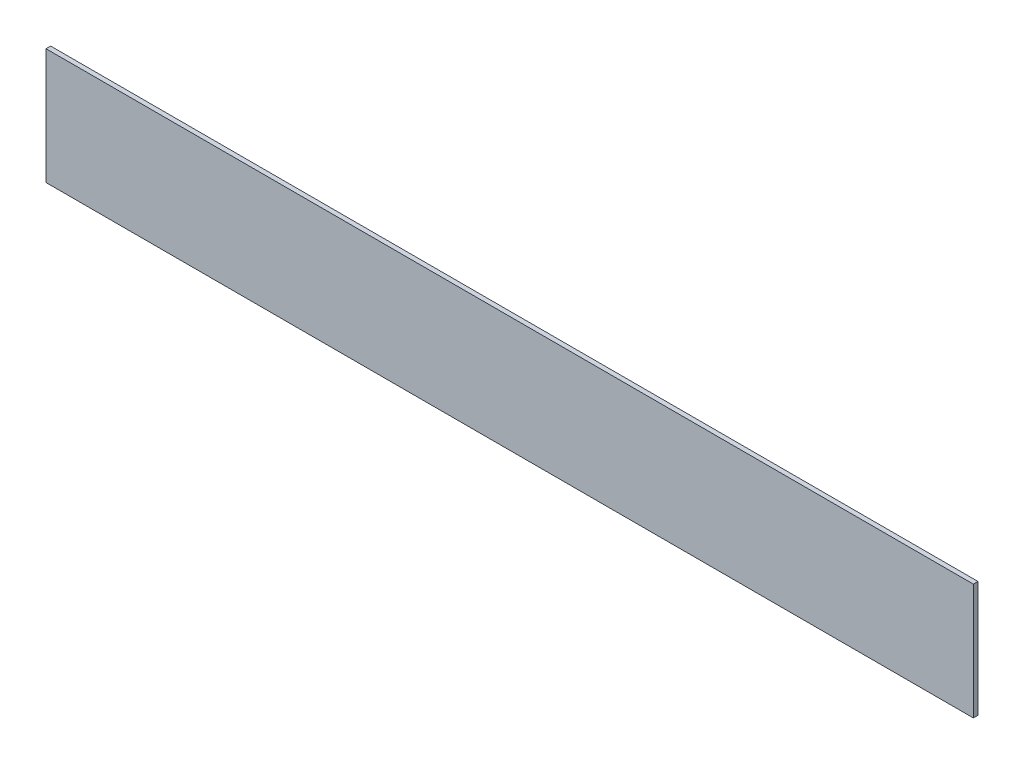
ISO-10303-21;
HEADER;
FILE_DESCRIPTION(('STEP AP214'),'2;1');
FILE_NAME('part.step','',(''),(''),'','','');
FILE_SCHEMA(('AUTOMOTIVE_DESIGN { 1 0 10303 214 1 1 1 1 }'));
ENDSEC;
DATA;
#1=APPLICATION_CONTEXT('core data for automotive mechanical design processes');
#2=APPLICATION_PROTOCOL_DEFINITION('international standard','automotive_design',2000,#1);
#3=PRODUCT_CONTEXT('',#1,'mechanical');
#4=PRODUCT('Part','Part','',(#3));
#5=PRODUCT_RELATED_PRODUCT_CATEGORY('part','',(#4));
#6=PRODUCT_DEFINITION_FORMATION('','',#4);
#7=PRODUCT_DEFINITION_CONTEXT('part definition',#1,'design');
#8=PRODUCT_DEFINITION('design','',#6,#7);
#9=PRODUCT_DEFINITION_SHAPE('','',#8);
#10=(LENGTH_UNIT() NAMED_UNIT(*) SI_UNIT(.MILLI.,.METRE.));
#11=(NAMED_UNIT(*) PLANE_ANGLE_UNIT() SI_UNIT($,.RADIAN.));
#12=(NAMED_UNIT(*) SI_UNIT($,.STERADIAN.) SOLID_ANGLE_UNIT());
#13=UNCERTAINTY_MEASURE_WITH_UNIT(LENGTH_MEASURE(1.E-05),#10,'distance_accuracy_value','');
#14=(GEOMETRIC_REPRESENTATION_CONTEXT(3) GLOBAL_UNCERTAINTY_ASSIGNED_CONTEXT((#13)) GLOBAL_UNIT_ASSIGNED_CONTEXT((#10,
#11,#12)) REPRESENTATION_CONTEXT('',''));
#15=CARTESIAN_POINT('',(0.,0.,0.));
#16=DIRECTION('',(0.,0.,1.));
#17=DIRECTION('',(1.,0.,0.));
#18=AXIS2_PLACEMENT_3D('',#15,#16,#17);
#19=CARTESIAN_POINT('',(0.,1.6,-1.6));
#20=DIRECTION('',(-1.,0.,0.));
#21=DIRECTION('',(0.,0.,1.));
#22=AXIS2_PLACEMENT_3D('',#19,#20,#21);
#23=PLANE('',#22);
#24=DIRECTION('',(0.,-1.,0.));
#25=VECTOR('',#24,1.);
#26=CARTESIAN_POINT('',(0.,1.6,0.));
#27=LINE('',#26,#25);
#28=CARTESIAN_POINT('',(0.,41.6,0.));
#29=VERTEX_POINT('',#28);
#30=CARTESIAN_POINT('',(0.,1.6,0.));
#31=VERTEX_POINT('',#30);
#32=EDGE_CURVE('E103',#29,#31,#27,.T.);
#33=ORIENTED_EDGE('',*,*,#32,.F.);
#34=DIRECTION('',(0.,0.,1.));
#35=VECTOR('',#34,1.);
#36=CARTESIAN_POINT('',(0.,41.6,-1.6));
#37=LINE('',#36,#35);
#38=CARTESIAN_POINT('',(0.,41.6,-1.6));
#39=VERTEX_POINT('',#38);
#40=EDGE_CURVE('E11',#39,#29,#37,.T.);
#41=ORIENTED_EDGE('',*,*,#40,.F.);
#42=DIRECTION('',(0.,-1.,0.));
#43=VECTOR('',#42,1.);
#44=CARTESIAN_POINT('',(0.,1.6,-1.6));
#45=LINE('',#44,#43);
#46=CARTESIAN_POINT('',(0.,1.6,-1.6));
#47=VERTEX_POINT('',#46);
#48=EDGE_CURVE('E97',#39,#47,#45,.T.);
#49=ORIENTED_EDGE('',*,*,#48,.T.);
#50=DIRECTION('',(0.,0.,1.));
#51=VECTOR('',#50,1.);
#52=CARTESIAN_POINT('',(0.,1.6,-1.6));
#53=LINE('',#52,#51);
#54=EDGE_CURVE('E42',#47,#31,#53,.T.);
#55=ORIENTED_EDGE('',*,*,#54,.T.);
#56=EDGE_LOOP('',(#33,#41,#49,#55));
#57=FACE_BOUND('',#56,.T.);
#58=ADVANCED_FACE('F39',(#57),#23,.T.);
#59=CARTESIAN_POINT('',(0.,41.6,-1.6));
#60=DIRECTION('',(0.,1.,0.));
#61=DIRECTION('',(0.,0.,1.));
#62=AXIS2_PLACEMENT_3D('',#59,#60,#61);
#63=PLANE('',#62);
#64=DIRECTION('',(-1.,0.,0.));
#65=VECTOR('',#64,1.);
#66=CARTESIAN_POINT('',(0.,41.6,0.));
#67=LINE('',#66,#65);
#68=CARTESIAN_POINT('',(320.,41.6,0.));
#69=VERTEX_POINT('',#68);
#70=EDGE_CURVE('E99',#69,#29,#67,.T.);
#71=ORIENTED_EDGE('',*,*,#70,.F.);
#72=DIRECTION('',(0.,0.,1.));
#73=VECTOR('',#72,1.);
#74=CARTESIAN_POINT('',(320.,41.6,-1.6));
#75=LINE('',#74,#73);
#76=CARTESIAN_POINT('',(320.,41.6,-1.6));
#77=VERTEX_POINT('',#76);
#78=EDGE_CURVE('E48',#77,#69,#75,.T.);
#79=ORIENTED_EDGE('',*,*,#78,.F.);
#80=DIRECTION('',(-1.,0.,0.));
#81=VECTOR('',#80,1.);
#82=CARTESIAN_POINT('',(0.,41.6,-1.6));
#83=LINE('',#82,#81);
#84=EDGE_CURVE('E94',#77,#39,#83,.T.);
#85=ORIENTED_EDGE('',*,*,#84,.T.);
#86=ORIENTED_EDGE('',*,*,#40,.T.);
#87=EDGE_LOOP('',(#71,#79,#85,#86));
#88=FACE_BOUND('',#87,.T.);
#89=ADVANCED_FACE('F113',(#88),#63,.T.);
#90=CARTESIAN_POINT('',(320.,1.6,-1.6));
#91=DIRECTION('',(1.,0.,0.));
#92=DIRECTION('',(0.,0.,-1.));
#93=AXIS2_PLACEMENT_3D('',#90,#91,#92);
#94=PLANE('',#93);
#95=DIRECTION('',(0.,1.,0.));
#96=VECTOR('',#95,1.);
#97=CARTESIAN_POINT('',(320.,1.6,0.));
#98=LINE('',#97,#96);
#99=CARTESIAN_POINT('',(320.,1.6,0.));
#100=VERTEX_POINT('',#99);
#101=EDGE_CURVE('E89',#100,#69,#98,.T.);
#102=ORIENTED_EDGE('',*,*,#101,.F.);
#103=DIRECTION('',(0.,0.,1.));
#104=VECTOR('',#103,1.);
#105=CARTESIAN_POINT('',(320.,1.6,-1.6));
#106=LINE('',#105,#104);
#107=CARTESIAN_POINT('',(320.,1.6,-1.6));
#108=VERTEX_POINT('',#107);
#109=EDGE_CURVE('E84',#108,#100,#106,.T.);
#110=ORIENTED_EDGE('',*,*,#109,.F.);
#111=DIRECTION('',(0.,1.,0.));
#112=VECTOR('',#111,1.);
#113=CARTESIAN_POINT('',(320.,1.6,-1.6));
#114=LINE('',#113,#112);
#115=EDGE_CURVE('E87',#108,#77,#114,.T.);
#116=ORIENTED_EDGE('',*,*,#115,.T.);
#117=ORIENTED_EDGE('',*,*,#78,.T.);
#118=EDGE_LOOP('',(#102,#110,#116,#117));
#119=FACE_BOUND('',#118,.T.);
#120=ADVANCED_FACE('F86',(#119),#94,.T.);
#121=CARTESIAN_POINT('',(0.,1.6,-1.6));
#122=DIRECTION('',(0.,-1.,0.));
#123=DIRECTION('',(0.,0.,-1.));
#124=AXIS2_PLACEMENT_3D('',#121,#122,#123);
#125=PLANE('',#124);
#126=DIRECTION('',(1.,0.,0.));
#127=VECTOR('',#126,1.);
#128=CARTESIAN_POINT('',(0.,1.6,0.));
#129=LINE('',#128,#127);
#130=EDGE_CURVE('E106',#31,#100,#129,.T.);
#131=ORIENTED_EDGE('',*,*,#130,.F.);
#132=ORIENTED_EDGE('',*,*,#54,.F.);
#133=DIRECTION('',(1.,0.,0.));
#134=VECTOR('',#133,1.);
#135=CARTESIAN_POINT('',(0.,1.6,-1.6));
#136=LINE('',#135,#134);
#137=EDGE_CURVE('E93',#47,#108,#136,.T.);
#138=ORIENTED_EDGE('',*,*,#137,.T.);
#139=ORIENTED_EDGE('',*,*,#109,.T.);
#140=EDGE_LOOP('',(#131,#132,#138,#139));
#141=FACE_BOUND('',#140,.T.);
#142=ADVANCED_FACE('F96',(#141),#125,.T.);
#143=CARTESIAN_POINT('',(0.,0.,-1.6));
#144=DIRECTION('',(0.,0.,-1.));
#145=DIRECTION('',(-1.,0.,0.));
#146=AXIS2_PLACEMENT_3D('',#143,#144,#145);
#147=PLANE('',#146);
#148=ORIENTED_EDGE('',*,*,#48,.F.);
#149=ORIENTED_EDGE('',*,*,#84,.F.);
#150=ORIENTED_EDGE('',*,*,#115,.F.);
#151=ORIENTED_EDGE('',*,*,#137,.F.);
#152=EDGE_LOOP('',(#148,#149,#150,#151));
#153=FACE_BOUND('',#152,.T.);
#154=ADVANCED_FACE('F92',(#153),#147,.T.);
#155=CARTESIAN_POINT('',(0.,0.,0.));
#156=DIRECTION('',(0.,0.,-1.));
#157=DIRECTION('',(-1.,0.,0.));
#158=AXIS2_PLACEMENT_3D('',#155,#156,#157);
#159=PLANE('',#158);
#160=ORIENTED_EDGE('',*,*,#32,.T.);
#161=ORIENTED_EDGE('',*,*,#130,.T.);
#162=ORIENTED_EDGE('',*,*,#101,.T.);
#163=ORIENTED_EDGE('',*,*,#70,.T.);
#164=EDGE_LOOP('',(#160,#161,#162,#163));
#165=FACE_BOUND('',#164,.T.);
#166=ADVANCED_FACE('F112',(#165),#159,.F.);
#167=CLOSED_SHELL('',(#58,#89,#120,#142,#154,#166));
#168=MANIFOLD_SOLID_BREP('B2',#167);
#169=ADVANCED_BREP_SHAPE_REPRESENTATION('',(#18,#168),#14);
#170=SHAPE_DEFINITION_REPRESENTATION(#9,#169);
ENDSEC;
END-ISO-10303-21;
